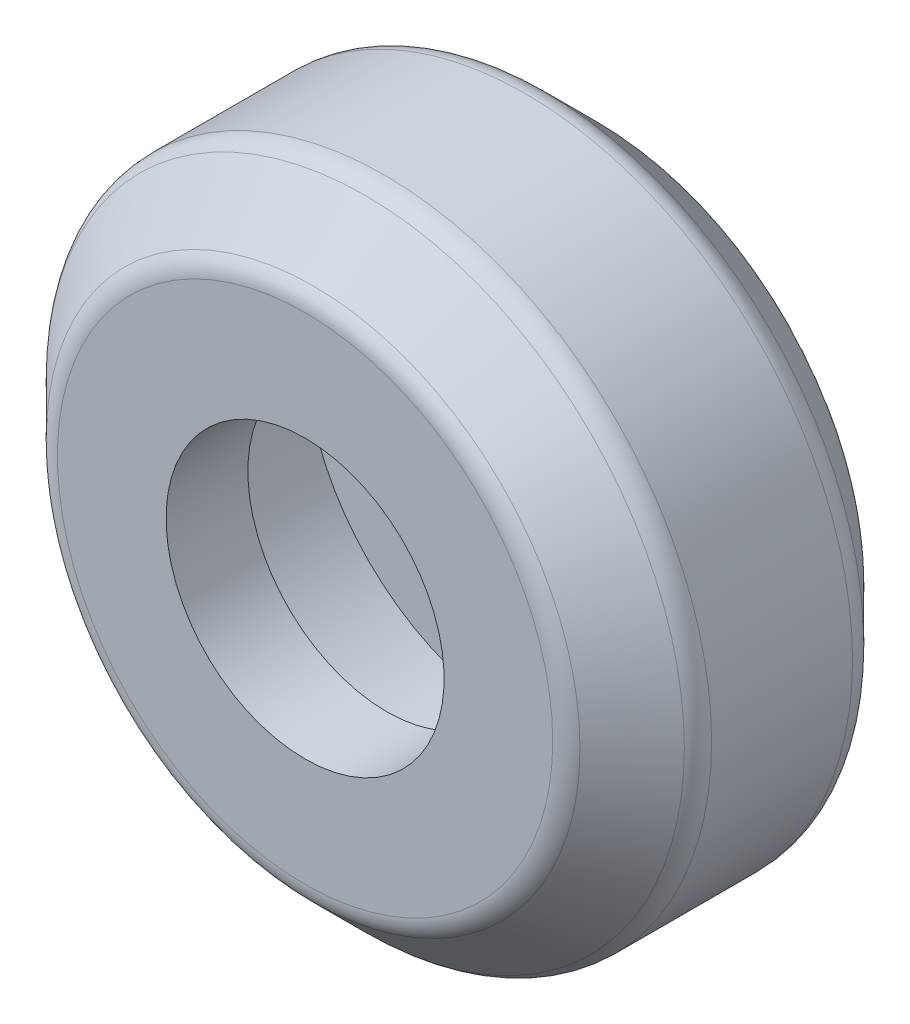
ISO-10303-21;
HEADER;
FILE_DESCRIPTION(('STEP AP214'),'2;1');
FILE_NAME('part.step','',(''),(''),'','','');
FILE_SCHEMA(('AUTOMOTIVE_DESIGN { 1 0 10303 214 1 1 1 1 }'));
ENDSEC;
DATA;
#1=APPLICATION_CONTEXT('core data for automotive mechanical design processes');
#2=APPLICATION_PROTOCOL_DEFINITION('international standard','automotive_design',2000,#1);
#3=PRODUCT_CONTEXT('',#1,'mechanical');
#4=PRODUCT('Part','Part','',(#3));
#5=PRODUCT_RELATED_PRODUCT_CATEGORY('part','',(#4));
#6=PRODUCT_DEFINITION_FORMATION('','',#4);
#7=PRODUCT_DEFINITION_CONTEXT('part definition',#1,'design');
#8=PRODUCT_DEFINITION('design','',#6,#7);
#9=PRODUCT_DEFINITION_SHAPE('','',#8);
#10=(LENGTH_UNIT() NAMED_UNIT(*) SI_UNIT(.MILLI.,.METRE.));
#11=(NAMED_UNIT(*) PLANE_ANGLE_UNIT() SI_UNIT($,.RADIAN.));
#12=(NAMED_UNIT(*) SI_UNIT($,.STERADIAN.) SOLID_ANGLE_UNIT());
#13=UNCERTAINTY_MEASURE_WITH_UNIT(LENGTH_MEASURE(1.E-05),#10,'distance_accuracy_value','');
#14=(GEOMETRIC_REPRESENTATION_CONTEXT(3) GLOBAL_UNCERTAINTY_ASSIGNED_CONTEXT((#13)) GLOBAL_UNIT_ASSIGNED_CONTEXT((#10,
#11,#12)) REPRESENTATION_CONTEXT('',''));
#15=CARTESIAN_POINT('',(0.,0.,0.));
#16=DIRECTION('',(0.,0.,1.));
#17=DIRECTION('',(1.,0.,0.));
#18=AXIS2_PLACEMENT_3D('',#15,#16,#17);
#19=CARTESIAN_POINT('',(0.,0.,0.));
#20=DIRECTION('',(0.,0.,-1.));
#21=DIRECTION('',(0.,1.,0.));
#22=AXIS2_PLACEMENT_3D('',#19,#20,#21);
#23=CYLINDRICAL_SURFACE('',#22,8.);
#24=CARTESIAN_POINT('',(0.,0.,2.5));
#25=DIRECTION('',(0.,0.,-1.));
#26=DIRECTION('',(1.,0.,0.));
#27=AXIS2_PLACEMENT_3D('',#24,#25,#26);
#28=CIRCLE('',#27,8.);
#29=CARTESIAN_POINT('',(0.,-8.,2.5));
#30=VERTEX_POINT('',#29);
#31=EDGE_CURVE('E154',#30,#30,#28,.T.);
#32=ORIENTED_EDGE('',*,*,#31,.F.);
#33=DIRECTION('',(0.,0.,-1.));
#34=VECTOR('',#33,1.);
#35=CARTESIAN_POINT('',(0.,-8.,0.));
#36=LINE('',#35,#34);
#37=CARTESIAN_POINT('',(0.,-8.,-2.5));
#38=VERTEX_POINT('',#37);
#39=EDGE_CURVE('E11',#30,#38,#36,.T.);
#40=ORIENTED_EDGE('',*,*,#39,.T.);
#41=CARTESIAN_POINT('',(0.,0.,-2.5));
#42=DIRECTION('',(0.,0.,-1.));
#43=DIRECTION('',(1.,0.,0.));
#44=AXIS2_PLACEMENT_3D('',#41,#42,#43);
#45=CIRCLE('',#44,8.);
#46=EDGE_CURVE('E20',#38,#38,#45,.T.);
#47=ORIENTED_EDGE('',*,*,#46,.T.);
#48=ORIENTED_EDGE('',*,*,#39,.F.);
#49=EDGE_LOOP('',(#32,#40,#47,#48));
#50=FACE_BOUND('',#49,.T.);
#51=ADVANCED_FACE('F16',(#50),#23,.F.);
#52=CARTESIAN_POINT('',(0.,8.,-2.5));
#53=DIRECTION('',(0.,0.,1.));
#54=DIRECTION('',(1.,0.,0.));
#55=AXIS2_PLACEMENT_3D('',#52,#53,#54);
#56=PLANE('',#55);
#57=CARTESIAN_POINT('',(0.,0.,-2.5));
#58=DIRECTION('',(0.,0.,-1.));
#59=DIRECTION('',(1.,0.,0.));
#60=AXIS2_PLACEMENT_3D('',#57,#58,#59);
#61=CIRCLE('',#60,5.1);
#62=CARTESIAN_POINT('',(0.,-5.1,-2.5));
#63=VERTEX_POINT('',#62);
#64=EDGE_CURVE('E160',#63,#63,#61,.T.);
#65=ORIENTED_EDGE('',*,*,#64,.T.);
#66=EDGE_LOOP('',(#65));
#67=FACE_BOUND('',#66,.T.);
#68=ORIENTED_EDGE('',*,*,#46,.F.);
#69=EDGE_LOOP('',(#68));
#70=FACE_BOUND('',#69,.T.);
#71=ADVANCED_FACE('F18',(#67,#70),#56,.T.);
#72=CARTESIAN_POINT('',(0.,0.,-4.));
#73=DIRECTION('',(0.,0.,-1.));
#74=DIRECTION('',(0.,1.,0.));
#75=AXIS2_PLACEMENT_3D('',#72,#73,#74);
#76=CYLINDRICAL_SURFACE('',#75,5.1);
#77=ORIENTED_EDGE('',*,*,#64,.F.);
#78=DIRECTION('',(0.,0.,-1.));
#79=VECTOR('',#78,1.);
#80=CARTESIAN_POINT('',(0.,-5.1,-4.));
#81=LINE('',#80,#79);
#82=CARTESIAN_POINT('',(0.,-5.1,-5.5));
#83=VERTEX_POINT('',#82);
#84=EDGE_CURVE('E76',#63,#83,#81,.T.);
#85=ORIENTED_EDGE('',*,*,#84,.T.);
#86=CARTESIAN_POINT('',(0.,0.,-5.5));
#87=DIRECTION('',(0.,0.,-1.));
#88=DIRECTION('',(1.,0.,0.));
#89=AXIS2_PLACEMENT_3D('',#86,#87,#88);
#90=CIRCLE('',#89,5.1);
#91=EDGE_CURVE('E202',#83,#83,#90,.T.);
#92=ORIENTED_EDGE('',*,*,#91,.T.);
#93=ORIENTED_EDGE('',*,*,#84,.F.);
#94=EDGE_LOOP('',(#77,#85,#92,#93));
#95=FACE_BOUND('',#94,.T.);
#96=ADVANCED_FACE('F249',(#95),#76,.F.);
#97=CARTESIAN_POINT('',(0.,0.,4.));
#98=DIRECTION('',(0.,0.,-1.));
#99=DIRECTION('',(0.,1.,0.));
#100=AXIS2_PLACEMENT_3D('',#97,#98,#99);
#101=CYLINDRICAL_SURFACE('',#100,5.1);
#102=CARTESIAN_POINT('',(0.,0.,5.5));
#103=DIRECTION('',(0.,0.,-1.));
#104=DIRECTION('',(1.,0.,0.));
#105=AXIS2_PLACEMENT_3D('',#102,#103,#104);
#106=CIRCLE('',#105,5.1);
#107=CARTESIAN_POINT('',(0.,-5.1,5.5));
#108=VERTEX_POINT('',#107);
#109=EDGE_CURVE('E120',#108,#108,#106,.T.);
#110=ORIENTED_EDGE('',*,*,#109,.F.);
#111=DIRECTION('',(0.,0.,-1.));
#112=VECTOR('',#111,1.);
#113=CARTESIAN_POINT('',(0.,-5.1,4.));
#114=LINE('',#113,#112);
#115=CARTESIAN_POINT('',(0.,-5.1,2.5));
#116=VERTEX_POINT('',#115);
#117=EDGE_CURVE('E153',#108,#116,#114,.T.);
#118=ORIENTED_EDGE('',*,*,#117,.T.);
#119=CARTESIAN_POINT('',(0.,0.,2.5));
#120=DIRECTION('',(0.,0.,-1.));
#121=DIRECTION('',(1.,0.,0.));
#122=AXIS2_PLACEMENT_3D('',#119,#120,#121);
#123=CIRCLE('',#122,5.1);
#124=EDGE_CURVE('E149',#116,#116,#123,.T.);
#125=ORIENTED_EDGE('',*,*,#124,.T.);
#126=ORIENTED_EDGE('',*,*,#117,.F.);
#127=EDGE_LOOP('',(#110,#118,#125,#126));
#128=FACE_BOUND('',#127,.T.);
#129=ADVANCED_FACE('F268',(#128),#101,.F.);
#130=CARTESIAN_POINT('',(0.,5.1,2.5));
#131=DIRECTION('',(0.,0.,-1.));
#132=DIRECTION('',(0.,-1.,0.));
#133=AXIS2_PLACEMENT_3D('',#130,#131,#132);
#134=PLANE('',#133);
#135=ORIENTED_EDGE('',*,*,#124,.F.);
#136=EDGE_LOOP('',(#135));
#137=FACE_BOUND('',#136,.T.);
#138=ORIENTED_EDGE('',*,*,#31,.T.);
#139=EDGE_LOOP('',(#138));
#140=FACE_BOUND('',#139,.T.);
#141=ADVANCED_FACE('F261',(#137,#140),#134,.T.);
#142=CARTESIAN_POINT('',(0.,0.,-2.58578643762691));
#143=DIRECTION('',(0.,0.,-1.));
#144=DIRECTION('',(-1.,0.,0.));
#145=AXIS2_PLACEMENT_3D('',#142,#143,#144);
#146=TOROIDAL_SURFACE('',#145,11.,1.);
#147=CARTESIAN_POINT('',(0.,0.,-3.29289321881345));
#148=DIRECTION('',(0.,0.,1.));
#149=DIRECTION('',(0.,-1.,0.));
#150=AXIS2_PLACEMENT_3D('',#147,#148,#149);
#151=CIRCLE('',#150,11.7071067811865);
#152=CARTESIAN_POINT('',(11.7071067811865,0.,-3.29289321881345));
#153=VERTEX_POINT('',#152);
#154=CARTESIAN_POINT('',(0.,11.7071067811865,-3.29289321881347));
#155=VERTEX_POINT('',#154);
#156=EDGE_CURVE('E164',#153,#155,#151,.T.);
#157=ORIENTED_EDGE('',*,*,#156,.T.);
#158=CARTESIAN_POINT('',(0.,0.,-3.29289321881345));
#159=DIRECTION('',(0.,0.,1.));
#160=DIRECTION('',(0.,-1.,0.));
#161=AXIS2_PLACEMENT_3D('',#158,#159,#160);
#162=CIRCLE('',#161,11.7071067811865);
#163=EDGE_CURVE('E167',#155,#153,#162,.T.);
#164=ORIENTED_EDGE('',*,*,#163,.T.);
#165=CARTESIAN_POINT('',(11.,0.,-2.58578643762691));
#166=DIRECTION('',(0.,-1.,0.));
#167=DIRECTION('',(1.,0.,0.));
#168=AXIS2_PLACEMENT_3D('',#165,#166,#167);
#169=CIRCLE('',#168,1.);
#170=CARTESIAN_POINT('',(12.,0.,-2.58578643762691));
#171=VERTEX_POINT('',#170);
#172=EDGE_CURVE('E209',#153,#171,#169,.T.);
#173=ORIENTED_EDGE('',*,*,#172,.T.);
#174=CARTESIAN_POINT('',(0.,0.,-2.58578643762691));
#175=DIRECTION('',(0.,0.,-1.));
#176=DIRECTION('',(0.,-1.,0.));
#177=AXIS2_PLACEMENT_3D('',#174,#175,#176);
#178=CIRCLE('',#177,12.);
#179=CARTESIAN_POINT('',(0.,-12.,-2.58578643762691));
#180=VERTEX_POINT('',#179);
#181=EDGE_CURVE('E177',#171,#180,#178,.T.);
#182=ORIENTED_EDGE('',*,*,#181,.T.);
#183=CARTESIAN_POINT('',(0.,0.,-2.58578643762691));
#184=DIRECTION('',(0.,0.,-1.));
#185=DIRECTION('',(0.,-1.,0.));
#186=AXIS2_PLACEMENT_3D('',#183,#184,#185);
#187=CIRCLE('',#186,12.);
#188=EDGE_CURVE('E145',#180,#171,#187,.T.);
#189=ORIENTED_EDGE('',*,*,#188,.T.);
#190=ORIENTED_EDGE('',*,*,#172,.F.);
#191=EDGE_LOOP('',(#157,#164,#173,#182,#189,#190));
#192=FACE_BOUND('',#191,.T.);
#193=ADVANCED_FACE('F226',(#192),#146,.T.);
#194=CARTESIAN_POINT('',(0.,5.1,-5.5));
#195=DIRECTION('',(0.,0.,-1.));
#196=DIRECTION('',(0.,-1.,0.));
#197=AXIS2_PLACEMENT_3D('',#194,#195,#196);
#198=PLANE('',#197);
#199=ORIENTED_EDGE('',*,*,#91,.F.);
#200=EDGE_LOOP('',(#199));
#201=FACE_BOUND('',#200,.T.);
#202=CARTESIAN_POINT('',(0.,0.,-5.5));
#203=DIRECTION('',(0.,0.,1.));
#204=DIRECTION('',(0.,-1.,0.));
#205=AXIS2_PLACEMENT_3D('',#202,#203,#204);
#206=CIRCLE('',#205,9.08578643762691);
#207=CARTESIAN_POINT('',(-9.08578643762691,0.,-5.5));
#208=VERTEX_POINT('',#207);
#209=EDGE_CURVE('E159',#208,#208,#206,.T.);
#210=ORIENTED_EDGE('',*,*,#209,.F.);
#211=EDGE_LOOP('',(#210));
#212=FACE_BOUND('',#211,.T.);
#213=ADVANCED_FACE('F230',(#201,#212),#198,.T.);
#214=CARTESIAN_POINT('',(0.,0.,-4.25));
#215=DIRECTION('',(0.,0.,1.));
#216=DIRECTION('',(0.,-1.,0.));
#217=AXIS2_PLACEMENT_3D('',#214,#215,#216);
#218=CONICAL_SURFACE('',#217,10.75,0.785398163397448);
#219=ORIENTED_EDGE('',*,*,#156,.F.);
#220=ORIENTED_EDGE('',*,*,#163,.F.);
#221=DIRECTION('',(0.,-0.707106781186547,-0.707106781186548));
#222=VECTOR('',#221,1.);
#223=CARTESIAN_POINT('',(0.,10.75,-4.25));
#224=LINE('',#223,#222);
#225=CARTESIAN_POINT('',(0.,9.79289321881345,-5.20710678118655));
#226=VERTEX_POINT('',#225);
#227=EDGE_CURVE('E64',#155,#226,#224,.T.);
#228=ORIENTED_EDGE('',*,*,#227,.T.);
#229=CARTESIAN_POINT('',(0.,0.,-5.20710678118655));
#230=DIRECTION('',(0.,0.,-1.));
#231=DIRECTION('',(0.,-1.,0.));
#232=AXIS2_PLACEMENT_3D('',#229,#230,#231);
#233=CIRCLE('',#232,9.79289321881345);
#234=CARTESIAN_POINT('',(-9.79289321881345,0.,-5.20710678118655));
#235=VERTEX_POINT('',#234);
#236=EDGE_CURVE('E168',#235,#226,#233,.T.);
#237=ORIENTED_EDGE('',*,*,#236,.F.);
#238=CARTESIAN_POINT('',(0.,0.,-5.20710678118655));
#239=DIRECTION('',(0.,0.,-1.));
#240=DIRECTION('',(0.,-1.,0.));
#241=AXIS2_PLACEMENT_3D('',#238,#239,#240);
#242=CIRCLE('',#241,9.79289321881345);
#243=EDGE_CURVE('E141',#226,#235,#242,.T.);
#244=ORIENTED_EDGE('',*,*,#243,.F.);
#245=ORIENTED_EDGE('',*,*,#227,.F.);
#246=EDGE_LOOP('',(#219,#220,#228,#237,#244,#245));
#247=FACE_BOUND('',#246,.T.);
#248=ADVANCED_FACE('F227',(#247),#218,.T.);
#249=CARTESIAN_POINT('',(0.,0.,-4.5));
#250=DIRECTION('',(0.,0.,1.));
#251=DIRECTION('',(1.,0.,0.));
#252=AXIS2_PLACEMENT_3D('',#249,#250,#251);
#253=TOROIDAL_SURFACE('',#252,9.08578643762691,1.);
#254=ORIENTED_EDGE('',*,*,#243,.T.);
#255=CARTESIAN_POINT('',(-9.08578643762691,0.,-4.5));
#256=DIRECTION('',(0.,-1.,0.));
#257=DIRECTION('',(-1.,0.,0.));
#258=AXIS2_PLACEMENT_3D('',#255,#256,#257);
#259=CIRCLE('',#258,1.);
#260=EDGE_CURVE('E155',#235,#208,#259,.T.);
#261=ORIENTED_EDGE('',*,*,#260,.T.);
#262=ORIENTED_EDGE('',*,*,#209,.T.);
#263=ORIENTED_EDGE('',*,*,#260,.F.);
#264=ORIENTED_EDGE('',*,*,#236,.T.);
#265=EDGE_LOOP('',(#254,#261,#262,#263,#264));
#266=FACE_BOUND('',#265,.T.);
#267=ADVANCED_FACE('F229',(#266),#253,.T.);
#268=CARTESIAN_POINT('',(0.,0.,0.));
#269=DIRECTION('',(0.,0.,-1.));
#270=DIRECTION('',(0.,1.,0.));
#271=AXIS2_PLACEMENT_3D('',#268,#269,#270);
#272=CYLINDRICAL_SURFACE('',#271,12.);
#273=ORIENTED_EDGE('',*,*,#181,.F.);
#274=ORIENTED_EDGE('',*,*,#188,.F.);
#275=DIRECTION('',(0.,0.,1.));
#276=VECTOR('',#275,1.);
#277=CARTESIAN_POINT('',(0.,-12.,0.));
#278=LINE('',#277,#276);
#279=CARTESIAN_POINT('',(0.,-12.,2.58578643762691));
#280=VERTEX_POINT('',#279);
#281=EDGE_CURVE('E143',#180,#280,#278,.T.);
#282=ORIENTED_EDGE('',*,*,#281,.T.);
#283=CARTESIAN_POINT('',(0.,0.,2.58578643762691));
#284=DIRECTION('',(0.,0.,1.));
#285=DIRECTION('',(0.,-1.,0.));
#286=AXIS2_PLACEMENT_3D('',#283,#284,#285);
#287=CIRCLE('',#286,12.);
#288=CARTESIAN_POINT('',(-12.,0.,2.58578643762691));
#289=VERTEX_POINT('',#288);
#290=EDGE_CURVE('E182',#289,#280,#287,.T.);
#291=ORIENTED_EDGE('',*,*,#290,.F.);
#292=CARTESIAN_POINT('',(0.,0.,2.58578643762691));
#293=DIRECTION('',(0.,0.,1.));
#294=DIRECTION('',(0.,-1.,0.));
#295=AXIS2_PLACEMENT_3D('',#292,#293,#294);
#296=CIRCLE('',#295,12.);
#297=EDGE_CURVE('E181',#280,#289,#296,.T.);
#298=ORIENTED_EDGE('',*,*,#297,.F.);
#299=ORIENTED_EDGE('',*,*,#281,.F.);
#300=EDGE_LOOP('',(#273,#274,#282,#291,#298,#299));
#301=FACE_BOUND('',#300,.T.);
#302=ADVANCED_FACE('F237',(#301),#272,.T.);
#303=CARTESIAN_POINT('',(0.,0.,2.58578643762691));
#304=DIRECTION('',(0.,0.,1.));
#305=DIRECTION('',(1.,0.,0.));
#306=AXIS2_PLACEMENT_3D('',#303,#304,#305);
#307=TOROIDAL_SURFACE('',#306,11.,1.);
#308=CARTESIAN_POINT('',(0.,0.,3.29289321881345));
#309=DIRECTION('',(0.,0.,-1.));
#310=DIRECTION('',(0.,-1.,0.));
#311=AXIS2_PLACEMENT_3D('',#308,#309,#310);
#312=CIRCLE('',#311,11.7071067811865);
#313=CARTESIAN_POINT('',(-11.7071067811865,0.,3.29289321881345));
#314=VERTEX_POINT('',#313);
#315=CARTESIAN_POINT('',(0.,11.7071067811865,3.29289321881347));
#316=VERTEX_POINT('',#315);
#317=EDGE_CURVE('E129',#314,#316,#312,.T.);
#318=ORIENTED_EDGE('',*,*,#317,.T.);
#319=CARTESIAN_POINT('',(0.,0.,3.29289321881345));
#320=DIRECTION('',(0.,0.,-1.));
#321=DIRECTION('',(0.,-1.,0.));
#322=AXIS2_PLACEMENT_3D('',#319,#320,#321);
#323=CIRCLE('',#322,11.7071067811865);
#324=EDGE_CURVE('E117',#316,#314,#323,.T.);
#325=ORIENTED_EDGE('',*,*,#324,.T.);
#326=CARTESIAN_POINT('',(-11.,0.,2.58578643762691));
#327=DIRECTION('',(0.,-1.,0.));
#328=DIRECTION('',(-1.,0.,0.));
#329=AXIS2_PLACEMENT_3D('',#326,#327,#328);
#330=CIRCLE('',#329,1.);
#331=EDGE_CURVE('E173',#314,#289,#330,.T.);
#332=ORIENTED_EDGE('',*,*,#331,.T.);
#333=ORIENTED_EDGE('',*,*,#290,.T.);
#334=ORIENTED_EDGE('',*,*,#297,.T.);
#335=ORIENTED_EDGE('',*,*,#331,.F.);
#336=EDGE_LOOP('',(#318,#325,#332,#333,#334,#335));
#337=FACE_BOUND('',#336,.T.);
#338=ADVANCED_FACE('F252',(#337),#307,.T.);
#339=CARTESIAN_POINT('',(0.,12.,5.5));
#340=DIRECTION('',(0.,0.,1.));
#341=DIRECTION('',(1.,0.,0.));
#342=AXIS2_PLACEMENT_3D('',#339,#340,#341);
#343=PLANE('',#342);
#344=ORIENTED_EDGE('',*,*,#109,.T.);
#345=EDGE_LOOP('',(#344));
#346=FACE_BOUND('',#345,.T.);
#347=CARTESIAN_POINT('',(0.,0.,5.5));
#348=DIRECTION('',(0.,0.,-1.));
#349=DIRECTION('',(0.,-1.,0.));
#350=AXIS2_PLACEMENT_3D('',#347,#348,#349);
#351=CIRCLE('',#350,9.08578643762691);
#352=CARTESIAN_POINT('',(9.08578643762691,0.,5.5));
#353=VERTEX_POINT('',#352);
#354=EDGE_CURVE('E130',#353,#353,#351,.T.);
#355=ORIENTED_EDGE('',*,*,#354,.F.);
#356=EDGE_LOOP('',(#355));
#357=FACE_BOUND('',#356,.T.);
#358=ADVANCED_FACE('F255',(#346,#357),#343,.T.);
#359=CARTESIAN_POINT('',(0.,0.,4.25));
#360=DIRECTION('',(0.,0.,-1.));
#361=DIRECTION('',(0.,-1.,0.));
#362=AXIS2_PLACEMENT_3D('',#359,#360,#361);
#363=CONICAL_SURFACE('',#362,10.75,0.785398163397448);
#364=ORIENTED_EDGE('',*,*,#317,.F.);
#365=ORIENTED_EDGE('',*,*,#324,.F.);
#366=DIRECTION('',(0.,-0.707106781186547,0.707106781186548));
#367=VECTOR('',#366,1.);
#368=CARTESIAN_POINT('',(0.,10.75,4.25));
#369=LINE('',#368,#367);
#370=CARTESIAN_POINT('',(0.,9.79289321881345,5.20710678118655));
#371=VERTEX_POINT('',#370);
#372=EDGE_CURVE('E113',#316,#371,#369,.T.);
#373=ORIENTED_EDGE('',*,*,#372,.T.);
#374=CARTESIAN_POINT('',(0.,0.,5.20710678118655));
#375=DIRECTION('',(0.,0.,1.));
#376=DIRECTION('',(0.,-1.,0.));
#377=AXIS2_PLACEMENT_3D('',#374,#375,#376);
#378=CIRCLE('',#377,9.79289321881345);
#379=CARTESIAN_POINT('',(9.79289321881345,0.,5.20710678118655));
#380=VERTEX_POINT('',#379);
#381=EDGE_CURVE('E107',#380,#371,#378,.T.);
#382=ORIENTED_EDGE('',*,*,#381,.F.);
#383=CARTESIAN_POINT('',(0.,0.,5.20710678118655));
#384=DIRECTION('',(0.,0.,1.));
#385=DIRECTION('',(0.,-1.,0.));
#386=AXIS2_PLACEMENT_3D('',#383,#384,#385);
#387=CIRCLE('',#386,9.79289321881345);
#388=EDGE_CURVE('E126',#371,#380,#387,.T.);
#389=ORIENTED_EDGE('',*,*,#388,.F.);
#390=ORIENTED_EDGE('',*,*,#372,.F.);
#391=EDGE_LOOP('',(#364,#365,#373,#382,#389,#390));
#392=FACE_BOUND('',#391,.T.);
#393=ADVANCED_FACE('F115',(#392),#363,.T.);
#394=CARTESIAN_POINT('',(0.,0.,4.5));
#395=DIRECTION('',(0.,0.,-1.));
#396=DIRECTION('',(-1.,0.,0.));
#397=AXIS2_PLACEMENT_3D('',#394,#395,#396);
#398=TOROIDAL_SURFACE('',#397,9.08578643762691,1.);
#399=ORIENTED_EDGE('',*,*,#388,.T.);
#400=CARTESIAN_POINT('',(9.08578643762691,0.,4.5));
#401=DIRECTION('',(0.,-1.,0.));
#402=DIRECTION('',(1.,0.,0.));
#403=AXIS2_PLACEMENT_3D('',#400,#401,#402);
#404=CIRCLE('',#403,1.);
#405=EDGE_CURVE('E127',#380,#353,#404,.T.);
#406=ORIENTED_EDGE('',*,*,#405,.T.);
#407=ORIENTED_EDGE('',*,*,#354,.T.);
#408=ORIENTED_EDGE('',*,*,#405,.F.);
#409=ORIENTED_EDGE('',*,*,#381,.T.);
#410=EDGE_LOOP('',(#399,#406,#407,#408,#409));
#411=FACE_BOUND('',#410,.T.);
#412=ADVANCED_FACE('F124',(#411),#398,.T.);
#413=CLOSED_SHELL('',(#51,#71,#96,#129,#141,#193,#213,#248,#267,#302,#338,#358,#393,#412));
#414=MANIFOLD_SOLID_BREP('B1',#413);
#415=ADVANCED_BREP_SHAPE_REPRESENTATION('',(#18,#414),#14);
#416=SHAPE_DEFINITION_REPRESENTATION(#9,#415);
ENDSEC;
END-ISO-10303-21;
